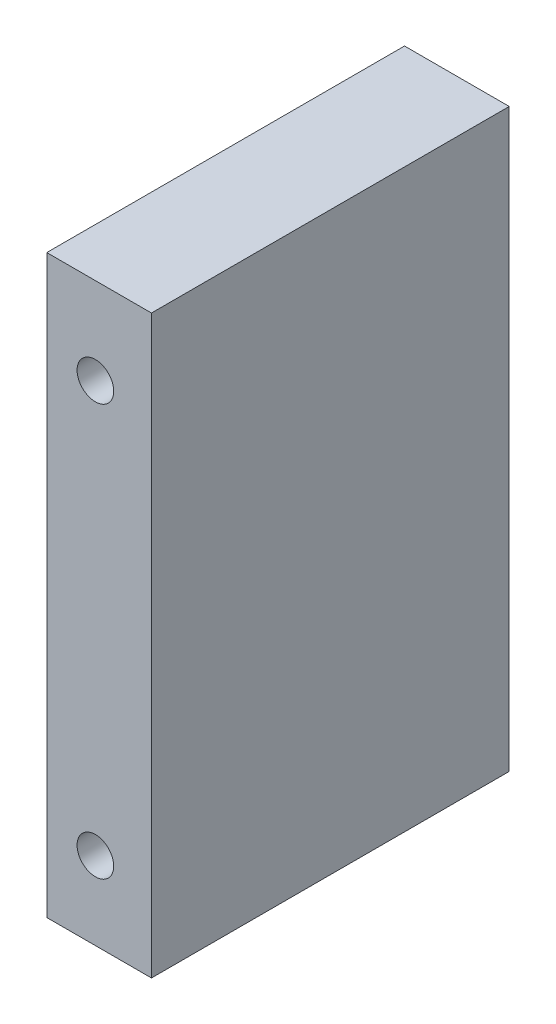
ISO-10303-21;
HEADER;
FILE_DESCRIPTION(('STEP AP214'),'2;1');
FILE_NAME('part.step','',(''),(''),'','','');
FILE_SCHEMA(('AUTOMOTIVE_DESIGN { 1 0 10303 214 1 1 1 1 }'));
ENDSEC;
DATA;
#1=APPLICATION_CONTEXT('core data for automotive mechanical design processes');
#2=APPLICATION_PROTOCOL_DEFINITION('international standard','automotive_design',2000,#1);
#3=PRODUCT_CONTEXT('',#1,'mechanical');
#4=PRODUCT('Part','Part','',(#3));
#5=PRODUCT_RELATED_PRODUCT_CATEGORY('part','',(#4));
#6=PRODUCT_DEFINITION_FORMATION('','',#4);
#7=PRODUCT_DEFINITION_CONTEXT('part definition',#1,'design');
#8=PRODUCT_DEFINITION('design','',#6,#7);
#9=PRODUCT_DEFINITION_SHAPE('','',#8);
#10=(LENGTH_UNIT() NAMED_UNIT(*) SI_UNIT(.MILLI.,.METRE.));
#11=(NAMED_UNIT(*) PLANE_ANGLE_UNIT() SI_UNIT($,.RADIAN.));
#12=(NAMED_UNIT(*) SI_UNIT($,.STERADIAN.) SOLID_ANGLE_UNIT());
#13=UNCERTAINTY_MEASURE_WITH_UNIT(LENGTH_MEASURE(1.E-05),#10,'distance_accuracy_value','');
#14=(GEOMETRIC_REPRESENTATION_CONTEXT(3) GLOBAL_UNCERTAINTY_ASSIGNED_CONTEXT((#13)) GLOBAL_UNIT_ASSIGNED_CONTEXT((#10,
#11,#12)) REPRESENTATION_CONTEXT('',''));
#15=CARTESIAN_POINT('',(0.,0.,0.));
#16=DIRECTION('',(0.,0.,1.));
#17=DIRECTION('',(1.,0.,0.));
#18=AXIS2_PLACEMENT_3D('',#15,#16,#17);
#19=CARTESIAN_POINT('',(-52.,-55.,41.));
#20=DIRECTION('',(1.,0.,0.));
#21=DIRECTION('',(0.,1.,0.));
#22=AXIS2_PLACEMENT_3D('',#19,#20,#21);
#23=PLANE('',#22);
#24=DIRECTION('',(0.,-1.,0.));
#25=VECTOR('',#24,1.);
#26=CARTESIAN_POINT('',(-52.,-55.,0.));
#27=LINE('',#26,#25);
#28=CARTESIAN_POINT('',(-52.,11.,0.));
#29=VERTEX_POINT('',#28);
#30=CARTESIAN_POINT('',(-52.,-55.,0.));
#31=VERTEX_POINT('',#30);
#32=EDGE_CURVE('E127',#29,#31,#27,.T.);
#33=ORIENTED_EDGE('',*,*,#32,.T.);
#34=DIRECTION('',(0.,0.,-1.));
#35=VECTOR('',#34,1.);
#36=CARTESIAN_POINT('',(-52.,-55.,41.));
#37=LINE('',#36,#35);
#38=CARTESIAN_POINT('',(-52.,-55.,41.));
#39=VERTEX_POINT('',#38);
#40=EDGE_CURVE('E11',#39,#31,#37,.T.);
#41=ORIENTED_EDGE('',*,*,#40,.F.);
#42=DIRECTION('',(0.,-1.,0.));
#43=VECTOR('',#42,1.);
#44=CARTESIAN_POINT('',(-52.,-55.,41.));
#45=LINE('',#44,#43);
#46=CARTESIAN_POINT('',(-52.,11.,41.));
#47=VERTEX_POINT('',#46);
#48=EDGE_CURVE('E128',#47,#39,#45,.T.);
#49=ORIENTED_EDGE('',*,*,#48,.F.);
#50=DIRECTION('',(0.,0.,-1.));
#51=VECTOR('',#50,1.);
#52=CARTESIAN_POINT('',(-52.,11.,41.));
#53=LINE('',#52,#51);
#54=EDGE_CURVE('E134',#47,#29,#53,.T.);
#55=ORIENTED_EDGE('',*,*,#54,.T.);
#56=EDGE_LOOP('',(#33,#41,#49,#55));
#57=FACE_BOUND('',#56,.T.);
#58=ADVANCED_FACE('F34',(#57),#23,.F.);
#59=CARTESIAN_POINT('',(-52.,-55.,41.));
#60=DIRECTION('',(0.,1.,0.));
#61=DIRECTION('',(0.,0.,1.));
#62=AXIS2_PLACEMENT_3D('',#59,#60,#61);
#63=PLANE('',#62);
#64=DIRECTION('',(1.,0.,0.));
#65=VECTOR('',#64,1.);
#66=CARTESIAN_POINT('',(-52.,-55.,0.));
#67=LINE('',#66,#65);
#68=CARTESIAN_POINT('',(-40.,-55.,0.));
#69=VERTEX_POINT('',#68);
#70=EDGE_CURVE('E137',#31,#69,#67,.T.);
#71=ORIENTED_EDGE('',*,*,#70,.T.);
#72=DIRECTION('',(0.,0.,-1.));
#73=VECTOR('',#72,1.);
#74=CARTESIAN_POINT('',(-40.,-55.,41.));
#75=LINE('',#74,#73);
#76=CARTESIAN_POINT('',(-40.,-55.,41.));
#77=VERTEX_POINT('',#76);
#78=EDGE_CURVE('E42',#77,#69,#75,.T.);
#79=ORIENTED_EDGE('',*,*,#78,.F.);
#80=DIRECTION('',(1.,0.,0.));
#81=VECTOR('',#80,1.);
#82=CARTESIAN_POINT('',(-52.,-55.,41.));
#83=LINE('',#82,#81);
#84=EDGE_CURVE('E81',#39,#77,#83,.T.);
#85=ORIENTED_EDGE('',*,*,#84,.F.);
#86=ORIENTED_EDGE('',*,*,#40,.T.);
#87=EDGE_LOOP('',(#71,#79,#85,#86));
#88=FACE_BOUND('',#87,.T.);
#89=ADVANCED_FACE('F161',(#88),#63,.F.);
#90=CARTESIAN_POINT('',(-40.,-55.,41.));
#91=DIRECTION('',(-1.,0.,0.));
#92=DIRECTION('',(0.,-1.,0.));
#93=AXIS2_PLACEMENT_3D('',#90,#91,#92);
#94=PLANE('',#93);
#95=DIRECTION('',(0.,1.,0.));
#96=VECTOR('',#95,1.);
#97=CARTESIAN_POINT('',(-40.,-55.,0.));
#98=LINE('',#97,#96);
#99=CARTESIAN_POINT('',(-40.,11.,0.));
#100=VERTEX_POINT('',#99);
#101=EDGE_CURVE('E68',#69,#100,#98,.T.);
#102=ORIENTED_EDGE('',*,*,#101,.T.);
#103=DIRECTION('',(0.,0.,-1.));
#104=VECTOR('',#103,1.);
#105=CARTESIAN_POINT('',(-40.,11.,41.));
#106=LINE('',#105,#104);
#107=CARTESIAN_POINT('',(-40.,11.,41.));
#108=VERTEX_POINT('',#107);
#109=EDGE_CURVE('E142',#108,#100,#106,.T.);
#110=ORIENTED_EDGE('',*,*,#109,.F.);
#111=DIRECTION('',(0.,1.,0.));
#112=VECTOR('',#111,1.);
#113=CARTESIAN_POINT('',(-40.,-55.,41.));
#114=LINE('',#113,#112);
#115=EDGE_CURVE('E131',#77,#108,#114,.T.);
#116=ORIENTED_EDGE('',*,*,#115,.F.);
#117=ORIENTED_EDGE('',*,*,#78,.T.);
#118=EDGE_LOOP('',(#102,#110,#116,#117));
#119=FACE_BOUND('',#118,.T.);
#120=ADVANCED_FACE('F144',(#119),#94,.F.);
#121=CARTESIAN_POINT('',(-52.,11.,41.));
#122=DIRECTION('',(0.,-1.,0.));
#123=DIRECTION('',(1.,0.,0.));
#124=AXIS2_PLACEMENT_3D('',#121,#122,#123);
#125=PLANE('',#124);
#126=DIRECTION('',(-1.,0.,0.));
#127=VECTOR('',#126,1.);
#128=CARTESIAN_POINT('',(-52.,11.,0.));
#129=LINE('',#128,#127);
#130=EDGE_CURVE('E74',#100,#29,#129,.T.);
#131=ORIENTED_EDGE('',*,*,#130,.T.);
#132=ORIENTED_EDGE('',*,*,#54,.F.);
#133=DIRECTION('',(-1.,0.,0.));
#134=VECTOR('',#133,1.);
#135=CARTESIAN_POINT('',(-52.,11.,41.));
#136=LINE('',#135,#134);
#137=EDGE_CURVE('E50',#108,#47,#136,.T.);
#138=ORIENTED_EDGE('',*,*,#137,.F.);
#139=ORIENTED_EDGE('',*,*,#109,.T.);
#140=EDGE_LOOP('',(#131,#132,#138,#139));
#141=FACE_BOUND('',#140,.T.);
#142=ADVANCED_FACE('F151',(#141),#125,.F.);
#143=CARTESIAN_POINT('',(0.,0.,41.));
#144=DIRECTION('',(0.,0.,-1.));
#145=DIRECTION('',(-1.,0.,0.));
#146=AXIS2_PLACEMENT_3D('',#143,#144,#145);
#147=PLANE('',#146);
#148=CARTESIAN_POINT('',(-46.43,-46.07,41.));
#149=DIRECTION('',(0.,0.,1.));
#150=DIRECTION('',(1.,0.,0.));
#151=AXIS2_PLACEMENT_3D('',#148,#149,#150);
#152=CIRCLE('',#151,2.09999999999999);
#153=CARTESIAN_POINT('',(-44.33,-46.07,41.));
#154=VERTEX_POINT('',#153);
#155=EDGE_CURVE('E105',#154,#154,#152,.T.);
#156=ORIENTED_EDGE('',*,*,#155,.F.);
#157=EDGE_LOOP('',(#156));
#158=FACE_BOUND('',#157,.T.);
#159=CARTESIAN_POINT('',(-46.43,1.07000000000005,41.));
#160=DIRECTION('',(0.,0.,1.));
#161=DIRECTION('',(1.,0.,0.));
#162=AXIS2_PLACEMENT_3D('',#159,#160,#161);
#163=CIRCLE('',#162,2.09999999999999);
#164=CARTESIAN_POINT('',(-44.33,1.07000000000005,41.));
#165=VERTEX_POINT('',#164);
#166=EDGE_CURVE('E104',#165,#165,#163,.T.);
#167=ORIENTED_EDGE('',*,*,#166,.F.);
#168=EDGE_LOOP('',(#167));
#169=FACE_BOUND('',#168,.T.);
#170=ORIENTED_EDGE('',*,*,#48,.T.);
#171=ORIENTED_EDGE('',*,*,#84,.T.);
#172=ORIENTED_EDGE('',*,*,#115,.T.);
#173=ORIENTED_EDGE('',*,*,#137,.T.);
#174=EDGE_LOOP('',(#170,#171,#172,#173));
#175=FACE_BOUND('',#174,.T.);
#176=ADVANCED_FACE('F153',(#158,#169,#175),#147,.F.);
#177=CARTESIAN_POINT('',(0.,0.,0.));
#178=DIRECTION('',(0.,0.,-1.));
#179=DIRECTION('',(-1.,0.,0.));
#180=AXIS2_PLACEMENT_3D('',#177,#178,#179);
#181=PLANE('',#180);
#182=CARTESIAN_POINT('',(-46.,-39.,0.));
#183=DIRECTION('',(0.,0.,-1.));
#184=DIRECTION('',(-1.,0.,0.));
#185=AXIS2_PLACEMENT_3D('',#182,#183,#184);
#186=CIRCLE('',#185,2.09999999999999);
#187=CARTESIAN_POINT('',(-48.1,-39.,0.));
#188=VERTEX_POINT('',#187);
#189=EDGE_CURVE('E115',#188,#188,#186,.T.);
#190=ORIENTED_EDGE('',*,*,#189,.F.);
#191=EDGE_LOOP('',(#190));
#192=FACE_BOUND('',#191,.T.);
#193=CARTESIAN_POINT('',(-46.,-5.00000000000001,0.));
#194=DIRECTION('',(0.,0.,-1.));
#195=DIRECTION('',(-1.,0.,0.));
#196=AXIS2_PLACEMENT_3D('',#193,#194,#195);
#197=CIRCLE('',#196,2.09999999999999);
#198=CARTESIAN_POINT('',(-48.1,-5.00000000000001,0.));
#199=VERTEX_POINT('',#198);
#200=EDGE_CURVE('E121',#199,#199,#197,.T.);
#201=ORIENTED_EDGE('',*,*,#200,.F.);
#202=EDGE_LOOP('',(#201));
#203=FACE_BOUND('',#202,.T.);
#204=ORIENTED_EDGE('',*,*,#32,.F.);
#205=ORIENTED_EDGE('',*,*,#130,.F.);
#206=ORIENTED_EDGE('',*,*,#101,.F.);
#207=ORIENTED_EDGE('',*,*,#70,.F.);
#208=EDGE_LOOP('',(#204,#205,#206,#207));
#209=FACE_BOUND('',#208,.T.);
#210=ADVANCED_FACE('F147',(#192,#203,#209),#181,.T.);
#211=CARTESIAN_POINT('',(-46.,-5.00000000000001,25.));
#212=DIRECTION('',(0.,0.,-1.));
#213=DIRECTION('',(-1.,0.,0.));
#214=AXIS2_PLACEMENT_3D('',#211,#212,#213);
#215=CONICAL_SURFACE('',#214,2.09999999999998,1.02974425867665);
#216=CARTESIAN_POINT('',(-46.,-5.00000000000001,26.2618072999579));
#217=VERTEX_POINT('',#216);
#218=VERTEX_LOOP('',#217);
#219=FACE_BOUND('',#218,.T.);
#220=CARTESIAN_POINT('',(-46.,-5.00000000000001,25.));
#221=DIRECTION('',(0.,0.,-1.));
#222=DIRECTION('',(-1.,0.,0.));
#223=AXIS2_PLACEMENT_3D('',#220,#221,#222);
#224=CIRCLE('',#223,2.09999999999998);
#225=CARTESIAN_POINT('',(-48.1,-5.00000000000001,25.));
#226=VERTEX_POINT('',#225);
#227=EDGE_CURVE('E124',#226,#226,#224,.T.);
#228=ORIENTED_EDGE('',*,*,#227,.T.);
#229=EDGE_LOOP('',(#228));
#230=FACE_BOUND('',#229,.T.);
#231=ADVANCED_FACE('F188',(#219,#230),#215,.F.);
#232=CARTESIAN_POINT('',(-46.,-5.00000000000001,0.));
#233=DIRECTION('',(0.,0.,-1.));
#234=DIRECTION('',(-1.,0.,0.));
#235=AXIS2_PLACEMENT_3D('',#232,#233,#234);
#236=CYLINDRICAL_SURFACE('',#235,2.09999999999999);
#237=ORIENTED_EDGE('',*,*,#227,.F.);
#238=EDGE_LOOP('',(#237));
#239=FACE_BOUND('',#238,.T.);
#240=ORIENTED_EDGE('',*,*,#200,.T.);
#241=EDGE_LOOP('',(#240));
#242=FACE_BOUND('',#241,.T.);
#243=ADVANCED_FACE('F197',(#239,#242),#236,.F.);
#244=CARTESIAN_POINT('',(-46.,-39.,25.));
#245=DIRECTION('',(0.,0.,-1.));
#246=DIRECTION('',(-1.,0.,0.));
#247=AXIS2_PLACEMENT_3D('',#244,#245,#246);
#248=CONICAL_SURFACE('',#247,2.09999999999998,1.02974425867665);
#249=CARTESIAN_POINT('',(-46.,-39.,26.2618072999579));
#250=VERTEX_POINT('',#249);
#251=VERTEX_LOOP('',#250);
#252=FACE_BOUND('',#251,.T.);
#253=CARTESIAN_POINT('',(-46.,-39.,25.));
#254=DIRECTION('',(0.,0.,-1.));
#255=DIRECTION('',(-1.,0.,0.));
#256=AXIS2_PLACEMENT_3D('',#253,#254,#255);
#257=CIRCLE('',#256,2.09999999999998);
#258=CARTESIAN_POINT('',(-48.1,-39.,25.));
#259=VERTEX_POINT('',#258);
#260=EDGE_CURVE('E118',#259,#259,#257,.T.);
#261=ORIENTED_EDGE('',*,*,#260,.T.);
#262=EDGE_LOOP('',(#261));
#263=FACE_BOUND('',#262,.T.);
#264=ADVANCED_FACE('F207',(#252,#263),#248,.F.);
#265=CARTESIAN_POINT('',(-46.,-39.,0.));
#266=DIRECTION('',(0.,0.,-1.));
#267=DIRECTION('',(-1.,0.,0.));
#268=AXIS2_PLACEMENT_3D('',#265,#266,#267);
#269=CYLINDRICAL_SURFACE('',#268,2.09999999999999);
#270=ORIENTED_EDGE('',*,*,#260,.F.);
#271=EDGE_LOOP('',(#270));
#272=FACE_BOUND('',#271,.T.);
#273=ORIENTED_EDGE('',*,*,#189,.T.);
#274=EDGE_LOOP('',(#273));
#275=FACE_BOUND('',#274,.T.);
#276=ADVANCED_FACE('F217',(#272,#275),#269,.F.);
#277=CARTESIAN_POINT('',(-46.43,1.07000000000005,16.));
#278=DIRECTION('',(0.,0.,1.));
#279=DIRECTION('',(1.,0.,0.));
#280=AXIS2_PLACEMENT_3D('',#277,#278,#279);
#281=CONICAL_SURFACE('',#280,2.09999999999998,1.02974425867665);
#282=CARTESIAN_POINT('',(-46.43,1.07000000000005,14.7381927000421));
#283=VERTEX_POINT('',#282);
#284=VERTEX_LOOP('',#283);
#285=FACE_BOUND('',#284,.T.);
#286=CARTESIAN_POINT('',(-46.43,1.07000000000005,16.));
#287=DIRECTION('',(0.,0.,1.));
#288=DIRECTION('',(1.,0.,0.));
#289=AXIS2_PLACEMENT_3D('',#286,#287,#288);
#290=CIRCLE('',#289,2.09999999999998);
#291=CARTESIAN_POINT('',(-44.33,1.07000000000005,16.));
#292=VERTEX_POINT('',#291);
#293=EDGE_CURVE('E108',#292,#292,#290,.T.);
#294=ORIENTED_EDGE('',*,*,#293,.T.);
#295=EDGE_LOOP('',(#294));
#296=FACE_BOUND('',#295,.T.);
#297=ADVANCED_FACE('F227',(#285,#296),#281,.F.);
#298=CARTESIAN_POINT('',(-46.43,1.07000000000005,41.));
#299=DIRECTION('',(0.,0.,1.));
#300=DIRECTION('',(1.,0.,0.));
#301=AXIS2_PLACEMENT_3D('',#298,#299,#300);
#302=CYLINDRICAL_SURFACE('',#301,2.09999999999999);
#303=ORIENTED_EDGE('',*,*,#293,.F.);
#304=EDGE_LOOP('',(#303));
#305=FACE_BOUND('',#304,.T.);
#306=ORIENTED_EDGE('',*,*,#166,.T.);
#307=EDGE_LOOP('',(#306));
#308=FACE_BOUND('',#307,.T.);
#309=ADVANCED_FACE('F98',(#305,#308),#302,.F.);
#310=CARTESIAN_POINT('',(-46.43,-46.07,16.));
#311=DIRECTION('',(0.,0.,1.));
#312=DIRECTION('',(1.,0.,0.));
#313=AXIS2_PLACEMENT_3D('',#310,#311,#312);
#314=CONICAL_SURFACE('',#313,2.09999999999998,1.02974425867665);
#315=CARTESIAN_POINT('',(-46.43,-46.07,14.7381927000421));
#316=VERTEX_POINT('',#315);
#317=VERTEX_LOOP('',#316);
#318=FACE_BOUND('',#317,.T.);
#319=CARTESIAN_POINT('',(-46.43,-46.07,16.));
#320=DIRECTION('',(0.,0.,1.));
#321=DIRECTION('',(1.,0.,0.));
#322=AXIS2_PLACEMENT_3D('',#319,#320,#321);
#323=CIRCLE('',#322,2.09999999999998);
#324=CARTESIAN_POINT('',(-44.33,-46.07,16.));
#325=VERTEX_POINT('',#324);
#326=EDGE_CURVE('E102',#325,#325,#323,.T.);
#327=ORIENTED_EDGE('',*,*,#326,.T.);
#328=EDGE_LOOP('',(#327));
#329=FACE_BOUND('',#328,.T.);
#330=ADVANCED_FACE('F94',(#318,#329),#314,.F.);
#331=CARTESIAN_POINT('',(-46.43,-46.07,41.));
#332=DIRECTION('',(0.,0.,1.));
#333=DIRECTION('',(1.,0.,0.));
#334=AXIS2_PLACEMENT_3D('',#331,#332,#333);
#335=CYLINDRICAL_SURFACE('',#334,2.09999999999999);
#336=ORIENTED_EDGE('',*,*,#326,.F.);
#337=EDGE_LOOP('',(#336));
#338=FACE_BOUND('',#337,.T.);
#339=ORIENTED_EDGE('',*,*,#155,.T.);
#340=EDGE_LOOP('',(#339));
#341=FACE_BOUND('',#340,.T.);
#342=ADVANCED_FACE('F97',(#338,#341),#335,.F.);
#343=CLOSED_SHELL('',(#58,#89,#120,#142,#176,#210,#231,#243,#264,#276,#297,#309,#330,#342));
#344=MANIFOLD_SOLID_BREP('B2',#343);
#345=ADVANCED_BREP_SHAPE_REPRESENTATION('',(#18,#344),#14);
#346=SHAPE_DEFINITION_REPRESENTATION(#9,#345);
ENDSEC;
END-ISO-10303-21;
